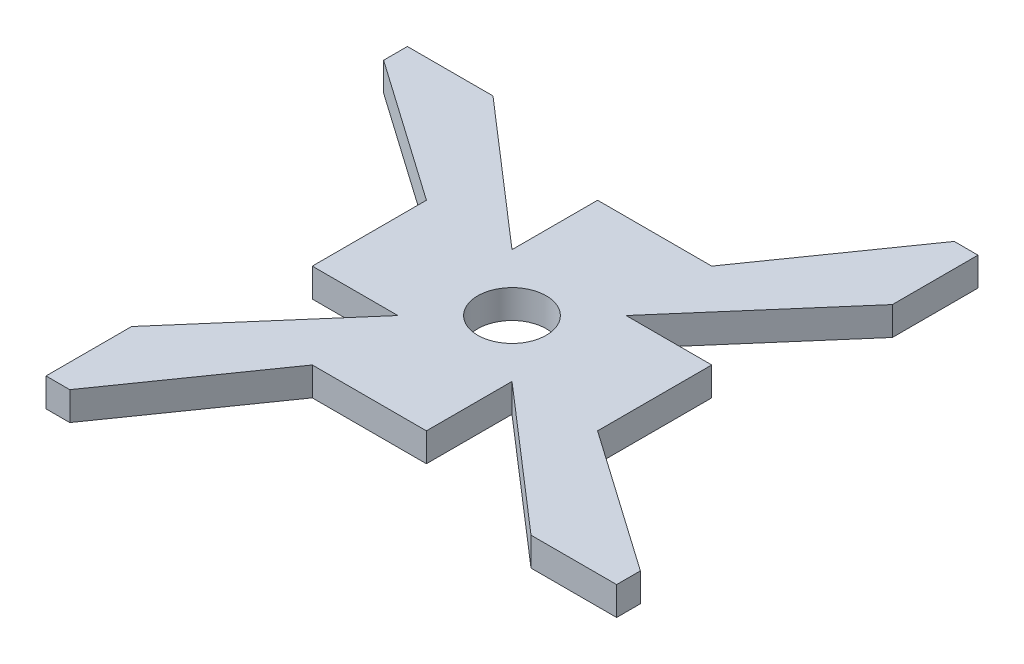
ISO-10303-21;
HEADER;
FILE_DESCRIPTION(('STEP AP214'),'2;1');
FILE_NAME('part.step','',(''),(''),'','','');
FILE_SCHEMA(('AUTOMOTIVE_DESIGN { 1 0 10303 214 1 1 1 1 }'));
ENDSEC;
DATA;
#1=APPLICATION_CONTEXT('core data for automotive mechanical design processes');
#2=APPLICATION_PROTOCOL_DEFINITION('international standard','automotive_design',2000,#1);
#3=PRODUCT_CONTEXT('',#1,'mechanical');
#4=PRODUCT('Part','Part','',(#3));
#5=PRODUCT_RELATED_PRODUCT_CATEGORY('part','',(#4));
#6=PRODUCT_DEFINITION_FORMATION('','',#4);
#7=PRODUCT_DEFINITION_CONTEXT('part definition',#1,'design');
#8=PRODUCT_DEFINITION('design','',#6,#7);
#9=PRODUCT_DEFINITION_SHAPE('','',#8);
#10=(LENGTH_UNIT() NAMED_UNIT(*) SI_UNIT(.MILLI.,.METRE.));
#11=(NAMED_UNIT(*) PLANE_ANGLE_UNIT() SI_UNIT($,.RADIAN.));
#12=(NAMED_UNIT(*) SI_UNIT($,.STERADIAN.) SOLID_ANGLE_UNIT());
#13=UNCERTAINTY_MEASURE_WITH_UNIT(LENGTH_MEASURE(1.E-05),#10,'distance_accuracy_value','');
#14=(GEOMETRIC_REPRESENTATION_CONTEXT(3) GLOBAL_UNCERTAINTY_ASSIGNED_CONTEXT((#13)) GLOBAL_UNIT_ASSIGNED_CONTEXT((#10,
#11,#12)) REPRESENTATION_CONTEXT('',''));
#15=CARTESIAN_POINT('',(0.,0.,0.));
#16=DIRECTION('',(0.,0.,1.));
#17=DIRECTION('',(1.,0.,0.));
#18=AXIS2_PLACEMENT_3D('',#15,#16,#17);
#19=CARTESIAN_POINT('',(-6.00000000000001,3.,0.));
#20=DIRECTION('',(1.,0.,0.));
#21=DIRECTION('',(0.,0.,-1.));
#22=AXIS2_PLACEMENT_3D('',#19,#20,#21);
#23=PLANE('',#22);
#24=DIRECTION('',(0.,0.,1.));
#25=VECTOR('',#24,1.);
#26=CARTESIAN_POINT('',(-6.00000000000001,0.,0.));
#27=LINE('',#26,#25);
#28=CARTESIAN_POINT('',(-6.00000000000001,0.,-15.));
#29=VERTEX_POINT('',#28);
#30=CARTESIAN_POINT('',(-6.00000000000001,0.,-6.));
#31=VERTEX_POINT('',#30);
#32=EDGE_CURVE('E240',#29,#31,#27,.T.);
#33=ORIENTED_EDGE('',*,*,#32,.T.);
#34=DIRECTION('',(0.,-1.,0.));
#35=VECTOR('',#34,1.);
#36=CARTESIAN_POINT('',(-6.00000000000001,3.,-6.));
#37=LINE('',#36,#35);
#38=CARTESIAN_POINT('',(-6.00000000000001,3.,-6.));
#39=VERTEX_POINT('',#38);
#40=EDGE_CURVE('E11',#39,#31,#37,.T.);
#41=ORIENTED_EDGE('',*,*,#40,.F.);
#42=DIRECTION('',(0.,0.,1.));
#43=VECTOR('',#42,1.);
#44=CARTESIAN_POINT('',(-6.00000000000001,3.,0.));
#45=LINE('',#44,#43);
#46=CARTESIAN_POINT('',(-6.00000000000001,3.,-15.));
#47=VERTEX_POINT('',#46);
#48=EDGE_CURVE('E142',#47,#39,#45,.T.);
#49=ORIENTED_EDGE('',*,*,#48,.F.);
#50=DIRECTION('',(0.,-1.,0.));
#51=VECTOR('',#50,1.);
#52=CARTESIAN_POINT('',(-6.00000000000001,3.,-15.));
#53=LINE('',#52,#51);
#54=EDGE_CURVE('E56',#47,#29,#53,.T.);
#55=ORIENTED_EDGE('',*,*,#54,.T.);
#56=EDGE_LOOP('',(#33,#41,#49,#55));
#57=FACE_BOUND('',#56,.T.);
#58=ADVANCED_FACE('F39',(#57),#23,.F.);
#59=CARTESIAN_POINT('',(0.395939086294416,3.,-0.456852791878173));
#60=DIRECTION('',(0.654930538417841,0.,-0.755689082789818));
#61=DIRECTION('',(-0.755689082789818,0.,-0.654930538417842));
#62=AXIS2_PLACEMENT_3D('',#59,#60,#61);
#63=PLANE('',#62);
#64=DIRECTION('',(0.755689082789818,0.,0.654930538417841));
#65=VECTOR('',#64,1.);
#66=CARTESIAN_POINT('',(0.395939086294416,0.,-0.456852791878173));
#67=LINE('',#66,#65);
#68=CARTESIAN_POINT('',(-21.,0.,-19.));
#69=VERTEX_POINT('',#68);
#70=EDGE_CURVE('E243',#69,#31,#67,.T.);
#71=ORIENTED_EDGE('',*,*,#70,.F.);
#72=DIRECTION('',(0.,-1.,0.));
#73=VECTOR('',#72,1.);
#74=CARTESIAN_POINT('',(-21.,3.,-19.));
#75=LINE('',#74,#73);
#76=CARTESIAN_POINT('',(-21.,3.,-19.));
#77=VERTEX_POINT('',#76);
#78=EDGE_CURVE('E48',#77,#69,#75,.T.);
#79=ORIENTED_EDGE('',*,*,#78,.F.);
#80=DIRECTION('',(0.755689082789818,0.,0.654930538417841));
#81=VECTOR('',#80,1.);
#82=CARTESIAN_POINT('',(0.395939086294416,3.,-0.456852791878173));
#83=LINE('',#82,#81);
#84=EDGE_CURVE('E501',#77,#39,#83,.T.);
#85=ORIENTED_EDGE('',*,*,#84,.T.);
#86=ORIENTED_EDGE('',*,*,#40,.T.);
#87=EDGE_LOOP('',(#71,#79,#85,#86));
#88=FACE_BOUND('',#87,.T.);
#89=ADVANCED_FACE('F405',(#88),#63,.T.);
#90=CARTESIAN_POINT('',(0.,3.,-19.));
#91=DIRECTION('',(0.,0.,-1.));
#92=DIRECTION('',(-1.,0.,0.));
#93=AXIS2_PLACEMENT_3D('',#90,#91,#92);
#94=PLANE('',#93);
#95=DIRECTION('',(1.,0.,0.));
#96=VECTOR('',#95,1.);
#97=CARTESIAN_POINT('',(0.,0.,-19.));
#98=LINE('',#97,#96);
#99=CARTESIAN_POINT('',(-30.,0.,-19.));
#100=VERTEX_POINT('',#99);
#101=EDGE_CURVE('E247',#100,#69,#98,.T.);
#102=ORIENTED_EDGE('',*,*,#101,.F.);
#103=DIRECTION('',(0.,-1.,0.));
#104=VECTOR('',#103,1.);
#105=CARTESIAN_POINT('',(-30.,3.,-19.));
#106=LINE('',#105,#104);
#107=CARTESIAN_POINT('',(-30.,3.,-19.));
#108=VERTEX_POINT('',#107);
#109=EDGE_CURVE('E393',#108,#100,#106,.T.);
#110=ORIENTED_EDGE('',*,*,#109,.F.);
#111=DIRECTION('',(1.,0.,0.));
#112=VECTOR('',#111,1.);
#113=CARTESIAN_POINT('',(0.,3.,-19.));
#114=LINE('',#113,#112);
#115=EDGE_CURVE('E402',#108,#77,#114,.T.);
#116=ORIENTED_EDGE('',*,*,#115,.T.);
#117=ORIENTED_EDGE('',*,*,#78,.T.);
#118=EDGE_LOOP('',(#102,#110,#116,#117));
#119=FACE_BOUND('',#118,.T.);
#120=ADVANCED_FACE('F400',(#119),#94,.T.);
#121=CARTESIAN_POINT('',(-30.,3.,0.));
#122=DIRECTION('',(1.,0.,0.));
#123=DIRECTION('',(0.,0.,-1.));
#124=AXIS2_PLACEMENT_3D('',#121,#122,#123);
#125=PLANE('',#124);
#126=DIRECTION('',(0.,0.,1.));
#127=VECTOR('',#126,1.);
#128=CARTESIAN_POINT('',(-30.,0.,0.));
#129=LINE('',#128,#127);
#130=CARTESIAN_POINT('',(-30.,0.,-16.5));
#131=VERTEX_POINT('',#130);
#132=EDGE_CURVE('E251',#100,#131,#129,.T.);
#133=ORIENTED_EDGE('',*,*,#132,.T.);
#134=DIRECTION('',(0.,-1.,0.));
#135=VECTOR('',#134,1.);
#136=CARTESIAN_POINT('',(-30.,3.,-16.5));
#137=LINE('',#136,#135);
#138=CARTESIAN_POINT('',(-30.,3.,-16.5));
#139=VERTEX_POINT('',#138);
#140=EDGE_CURVE('E389',#139,#131,#137,.T.);
#141=ORIENTED_EDGE('',*,*,#140,.F.);
#142=DIRECTION('',(0.,0.,1.));
#143=VECTOR('',#142,1.);
#144=CARTESIAN_POINT('',(-30.,3.,0.));
#145=LINE('',#144,#143);
#146=EDGE_CURVE('E424',#108,#139,#145,.T.);
#147=ORIENTED_EDGE('',*,*,#146,.F.);
#148=ORIENTED_EDGE('',*,*,#109,.T.);
#149=EDGE_LOOP('',(#133,#141,#147,#148));
#150=FACE_BOUND('',#149,.T.);
#151=ADVANCED_FACE('F414',(#150),#125,.F.);
#152=CARTESIAN_POINT('',(-2.11409395973153,3.,3.02013422818791));
#153=DIRECTION('',(0.573462344363328,0.,-0.819231920519041));
#154=DIRECTION('',(-0.819231920519041,0.,-0.573462344363328));
#155=AXIS2_PLACEMENT_3D('',#152,#153,#154);
#156=PLANE('',#155);
#157=DIRECTION('',(0.819231920519041,0.,0.573462344363328));
#158=VECTOR('',#157,1.);
#159=CARTESIAN_POINT('',(-2.11409395973153,0.,3.02013422818791));
#160=LINE('',#159,#158);
#161=CARTESIAN_POINT('',(-15.,0.,-6.00000000000001));
#162=VERTEX_POINT('',#161);
#163=EDGE_CURVE('E254',#131,#162,#160,.T.);
#164=ORIENTED_EDGE('',*,*,#163,.T.);
#165=DIRECTION('',(0.,-1.,0.));
#166=VECTOR('',#165,1.);
#167=CARTESIAN_POINT('',(-15.,3.,-6.00000000000001));
#168=LINE('',#167,#166);
#169=CARTESIAN_POINT('',(-15.,3.,-6.00000000000001));
#170=VERTEX_POINT('',#169);
#171=EDGE_CURVE('E385',#170,#162,#168,.T.);
#172=ORIENTED_EDGE('',*,*,#171,.F.);
#173=DIRECTION('',(0.819231920519041,0.,0.573462344363328));
#174=VECTOR('',#173,1.);
#175=CARTESIAN_POINT('',(-2.11409395973153,3.,3.02013422818791));
#176=LINE('',#175,#174);
#177=EDGE_CURVE('E420',#139,#170,#176,.T.);
#178=ORIENTED_EDGE('',*,*,#177,.F.);
#179=ORIENTED_EDGE('',*,*,#140,.T.);
#180=EDGE_LOOP('',(#164,#172,#178,#179));
#181=FACE_BOUND('',#180,.T.);
#182=ADVANCED_FACE('F418',(#181),#156,.F.);
#183=CARTESIAN_POINT('',(-15.,3.,0.));
#184=DIRECTION('',(1.,0.,0.));
#185=DIRECTION('',(0.,0.,-1.));
#186=AXIS2_PLACEMENT_3D('',#183,#184,#185);
#187=PLANE('',#186);
#188=DIRECTION('',(0.,0.,1.));
#189=VECTOR('',#188,1.);
#190=CARTESIAN_POINT('',(-15.,0.,0.));
#191=LINE('',#190,#189);
#192=CARTESIAN_POINT('',(-15.,0.,6.00000000000001));
#193=VERTEX_POINT('',#192);
#194=EDGE_CURVE('E257',#162,#193,#191,.T.);
#195=ORIENTED_EDGE('',*,*,#194,.T.);
#196=DIRECTION('',(0.,-1.,0.));
#197=VECTOR('',#196,1.);
#198=CARTESIAN_POINT('',(-15.,3.,6.00000000000001));
#199=LINE('',#198,#197);
#200=CARTESIAN_POINT('',(-15.,3.,6.00000000000001));
#201=VERTEX_POINT('',#200);
#202=EDGE_CURVE('E381',#201,#193,#199,.T.);
#203=ORIENTED_EDGE('',*,*,#202,.F.);
#204=DIRECTION('',(0.,0.,1.));
#205=VECTOR('',#204,1.);
#206=CARTESIAN_POINT('',(-15.,3.,0.));
#207=LINE('',#206,#205);
#208=EDGE_CURVE('E423',#170,#201,#207,.T.);
#209=ORIENTED_EDGE('',*,*,#208,.F.);
#210=ORIENTED_EDGE('',*,*,#171,.T.);
#211=EDGE_LOOP('',(#195,#203,#209,#210));
#212=FACE_BOUND('',#211,.T.);
#213=ADVANCED_FACE('F516',(#212),#187,.F.);
#214=CARTESIAN_POINT('',(0.,3.,6.00000000000001));
#215=DIRECTION('',(0.,0.,-1.));
#216=DIRECTION('',(-1.,0.,0.));
#217=AXIS2_PLACEMENT_3D('',#214,#215,#216);
#218=PLANE('',#217);
#219=DIRECTION('',(1.,0.,0.));
#220=VECTOR('',#219,1.);
#221=CARTESIAN_POINT('',(0.,0.,6.00000000000001));
#222=LINE('',#221,#220);
#223=CARTESIAN_POINT('',(-6.00000000000001,0.,6.00000000000001));
#224=VERTEX_POINT('',#223);
#225=EDGE_CURVE('E260',#193,#224,#222,.T.);
#226=ORIENTED_EDGE('',*,*,#225,.T.);
#227=DIRECTION('',(0.,-1.,0.));
#228=VECTOR('',#227,1.);
#229=CARTESIAN_POINT('',(-6.00000000000001,3.,6.00000000000001));
#230=LINE('',#229,#228);
#231=CARTESIAN_POINT('',(-6.00000000000001,3.,6.00000000000001));
#232=VERTEX_POINT('',#231);
#233=EDGE_CURVE('E378',#232,#224,#230,.T.);
#234=ORIENTED_EDGE('',*,*,#233,.F.);
#235=DIRECTION('',(1.,0.,0.));
#236=VECTOR('',#235,1.);
#237=CARTESIAN_POINT('',(0.,3.,6.00000000000001));
#238=LINE('',#237,#236);
#239=EDGE_CURVE('E428',#201,#232,#238,.T.);
#240=ORIENTED_EDGE('',*,*,#239,.F.);
#241=ORIENTED_EDGE('',*,*,#202,.T.);
#242=EDGE_LOOP('',(#226,#234,#240,#241));
#243=FACE_BOUND('',#242,.T.);
#244=ADVANCED_FACE('F519',(#243),#218,.F.);
#245=CARTESIAN_POINT('',(-0.456852791873291,3.,-0.395939086290185));
#246=DIRECTION('',(-0.755689082789818,0.,-0.654930538417841));
#247=DIRECTION('',(-0.654930538417841,0.,0.755689082789818));
#248=AXIS2_PLACEMENT_3D('',#245,#246,#247);
#249=PLANE('',#248);
#250=DIRECTION('',(0.654930538417841,0.,-0.755689082789818));
#251=VECTOR('',#250,1.);
#252=CARTESIAN_POINT('',(-0.456852791873291,0.,-0.395939086290185));
#253=LINE('',#252,#251);
#254=CARTESIAN_POINT('',(-18.9999999999914,0.,21.));
#255=VERTEX_POINT('',#254);
#256=EDGE_CURVE('E264',#255,#224,#253,.T.);
#257=ORIENTED_EDGE('',*,*,#256,.F.);
#258=DIRECTION('',(0.,-1.,0.));
#259=VECTOR('',#258,1.);
#260=CARTESIAN_POINT('',(-18.9999999999914,3.,21.));
#261=LINE('',#260,#259);
#262=CARTESIAN_POINT('',(-18.9999999999914,3.,21.));
#263=VERTEX_POINT('',#262);
#264=EDGE_CURVE('E375',#263,#255,#261,.T.);
#265=ORIENTED_EDGE('',*,*,#264,.F.);
#266=DIRECTION('',(0.654930538417841,0.,-0.755689082789818));
#267=VECTOR('',#266,1.);
#268=CARTESIAN_POINT('',(-0.456852791873291,3.,-0.395939086290185));
#269=LINE('',#268,#267);
#270=EDGE_CURVE('E435',#263,#232,#269,.T.);
#271=ORIENTED_EDGE('',*,*,#270,.T.);
#272=ORIENTED_EDGE('',*,*,#233,.T.);
#273=EDGE_LOOP('',(#257,#265,#271,#272));
#274=FACE_BOUND('',#273,.T.);
#275=ADVANCED_FACE('F523',(#274),#249,.T.);
#276=CARTESIAN_POINT('',(-18.9999999999914,3.,0.));
#277=DIRECTION('',(-1.,0.,0.));
#278=DIRECTION('',(0.,0.,1.));
#279=AXIS2_PLACEMENT_3D('',#276,#277,#278);
#280=PLANE('',#279);
#281=DIRECTION('',(0.,0.,-1.));
#282=VECTOR('',#281,1.);
#283=CARTESIAN_POINT('',(-18.9999999999914,0.,0.));
#284=LINE('',#283,#282);
#285=CARTESIAN_POINT('',(-18.9999999999914,0.,30.));
#286=VERTEX_POINT('',#285);
#287=EDGE_CURVE('E268',#286,#255,#284,.T.);
#288=ORIENTED_EDGE('',*,*,#287,.F.);
#289=DIRECTION('',(0.,-1.,0.));
#290=VECTOR('',#289,1.);
#291=CARTESIAN_POINT('',(-18.9999999999914,3.,30.));
#292=LINE('',#291,#290);
#293=CARTESIAN_POINT('',(-18.9999999999914,3.,30.));
#294=VERTEX_POINT('',#293);
#295=EDGE_CURVE('E372',#294,#286,#292,.T.);
#296=ORIENTED_EDGE('',*,*,#295,.F.);
#297=DIRECTION('',(0.,0.,-1.));
#298=VECTOR('',#297,1.);
#299=CARTESIAN_POINT('',(-18.9999999999914,3.,0.));
#300=LINE('',#299,#298);
#301=EDGE_CURVE('E439',#294,#263,#300,.T.);
#302=ORIENTED_EDGE('',*,*,#301,.T.);
#303=ORIENTED_EDGE('',*,*,#264,.T.);
#304=EDGE_LOOP('',(#288,#296,#302,#303));
#305=FACE_BOUND('',#304,.T.);
#306=ADVANCED_FACE('F527',(#305),#280,.T.);
#307=CARTESIAN_POINT('',(0.,3.,30.));
#308=DIRECTION('',(0.,0.,-1.));
#309=DIRECTION('',(-1.,0.,0.));
#310=AXIS2_PLACEMENT_3D('',#307,#308,#309);
#311=PLANE('',#310);
#312=DIRECTION('',(1.,0.,0.));
#313=VECTOR('',#312,1.);
#314=CARTESIAN_POINT('',(0.,0.,30.));
#315=LINE('',#314,#313);
#316=CARTESIAN_POINT('',(-16.4999999999914,0.,30.));
#317=VERTEX_POINT('',#316);
#318=EDGE_CURVE('E272',#286,#317,#315,.T.);
#319=ORIENTED_EDGE('',*,*,#318,.T.);
#320=DIRECTION('',(0.,-1.,0.));
#321=VECTOR('',#320,1.);
#322=CARTESIAN_POINT('',(-16.4999999999914,3.,30.));
#323=LINE('',#322,#321);
#324=CARTESIAN_POINT('',(-16.4999999999914,3.,30.));
#325=VERTEX_POINT('',#324);
#326=EDGE_CURVE('E368',#325,#317,#323,.T.);
#327=ORIENTED_EDGE('',*,*,#326,.F.);
#328=DIRECTION('',(1.,0.,0.));
#329=VECTOR('',#328,1.);
#330=CARTESIAN_POINT('',(0.,3.,30.));
#331=LINE('',#330,#329);
#332=EDGE_CURVE('E443',#294,#325,#331,.T.);
#333=ORIENTED_EDGE('',*,*,#332,.F.);
#334=ORIENTED_EDGE('',*,*,#295,.T.);
#335=EDGE_LOOP('',(#319,#327,#333,#334));
#336=FACE_BOUND('',#335,.T.);
#337=ADVANCED_FACE('F531',(#336),#311,.F.);
#338=CARTESIAN_POINT('',(3.02013422819364,3.,2.11409395973554));
#339=DIRECTION('',(-0.819231920519041,0.,-0.573462344363327));
#340=DIRECTION('',(-0.573462344363327,0.,0.819231920519041));
#341=AXIS2_PLACEMENT_3D('',#338,#339,#340);
#342=PLANE('',#341);
#343=DIRECTION('',(0.573462344363327,0.,-0.819231920519041));
#344=VECTOR('',#343,1.);
#345=CARTESIAN_POINT('',(3.02013422819364,0.,2.11409395973554));
#346=LINE('',#345,#344);
#347=CARTESIAN_POINT('',(-6.00000000000001,0.,15.));
#348=VERTEX_POINT('',#347);
#349=EDGE_CURVE('E275',#317,#348,#346,.T.);
#350=ORIENTED_EDGE('',*,*,#349,.T.);
#351=DIRECTION('',(0.,-1.,0.));
#352=VECTOR('',#351,1.);
#353=CARTESIAN_POINT('',(-6.00000000000001,3.,15.));
#354=LINE('',#353,#352);
#355=CARTESIAN_POINT('',(-6.00000000000001,3.,15.));
#356=VERTEX_POINT('',#355);
#357=EDGE_CURVE('E364',#356,#348,#354,.T.);
#358=ORIENTED_EDGE('',*,*,#357,.F.);
#359=DIRECTION('',(0.573462344363327,0.,-0.819231920519041));
#360=VECTOR('',#359,1.);
#361=CARTESIAN_POINT('',(3.02013422819364,3.,2.11409395973554));
#362=LINE('',#361,#360);
#363=EDGE_CURVE('E446',#325,#356,#362,.T.);
#364=ORIENTED_EDGE('',*,*,#363,.F.);
#365=ORIENTED_EDGE('',*,*,#326,.T.);
#366=EDGE_LOOP('',(#350,#358,#364,#365));
#367=FACE_BOUND('',#366,.T.);
#368=ADVANCED_FACE('F535',(#367),#342,.F.);
#369=CARTESIAN_POINT('',(0.,3.,15.));
#370=DIRECTION('',(0.,0.,-1.));
#371=DIRECTION('',(-1.,0.,0.));
#372=AXIS2_PLACEMENT_3D('',#369,#370,#371);
#373=PLANE('',#372);
#374=DIRECTION('',(1.,0.,0.));
#375=VECTOR('',#374,1.);
#376=CARTESIAN_POINT('',(0.,0.,15.));
#377=LINE('',#376,#375);
#378=CARTESIAN_POINT('',(6.00000000000001,0.,15.));
#379=VERTEX_POINT('',#378);
#380=EDGE_CURVE('E278',#348,#379,#377,.T.);
#381=ORIENTED_EDGE('',*,*,#380,.T.);
#382=DIRECTION('',(0.,-1.,0.));
#383=VECTOR('',#382,1.);
#384=CARTESIAN_POINT('',(6.00000000000001,3.,15.));
#385=LINE('',#384,#383);
#386=CARTESIAN_POINT('',(6.00000000000001,3.,15.));
#387=VERTEX_POINT('',#386);
#388=EDGE_CURVE('E361',#387,#379,#385,.T.);
#389=ORIENTED_EDGE('',*,*,#388,.F.);
#390=DIRECTION('',(1.,0.,0.));
#391=VECTOR('',#390,1.);
#392=CARTESIAN_POINT('',(0.,3.,15.));
#393=LINE('',#392,#391);
#394=EDGE_CURVE('E449',#356,#387,#393,.T.);
#395=ORIENTED_EDGE('',*,*,#394,.F.);
#396=ORIENTED_EDGE('',*,*,#357,.T.);
#397=EDGE_LOOP('',(#381,#389,#395,#396));
#398=FACE_BOUND('',#397,.T.);
#399=ADVANCED_FACE('F539',(#398),#373,.F.);
#400=CARTESIAN_POINT('',(6.00000000000001,3.,0.));
#401=DIRECTION('',(1.,0.,0.));
#402=DIRECTION('',(0.,0.,-1.));
#403=AXIS2_PLACEMENT_3D('',#400,#401,#402);
#404=PLANE('',#403);
#405=DIRECTION('',(0.,0.,1.));
#406=VECTOR('',#405,1.);
#407=CARTESIAN_POINT('',(6.00000000000001,0.,0.));
#408=LINE('',#407,#406);
#409=CARTESIAN_POINT('',(6.00000000000001,0.,6.00000000000001));
#410=VERTEX_POINT('',#409);
#411=EDGE_CURVE('E282',#410,#379,#408,.T.);
#412=ORIENTED_EDGE('',*,*,#411,.F.);
#413=DIRECTION('',(0.,-1.,0.));
#414=VECTOR('',#413,1.);
#415=CARTESIAN_POINT('',(6.00000000000001,3.,6.00000000000001));
#416=LINE('',#415,#414);
#417=CARTESIAN_POINT('',(6.00000000000001,3.,6.00000000000001));
#418=VERTEX_POINT('',#417);
#419=EDGE_CURVE('E358',#418,#410,#416,.T.);
#420=ORIENTED_EDGE('',*,*,#419,.F.);
#421=DIRECTION('',(0.,0.,1.));
#422=VECTOR('',#421,1.);
#423=CARTESIAN_POINT('',(6.00000000000001,3.,0.));
#424=LINE('',#423,#422);
#425=EDGE_CURVE('E452',#418,#387,#424,.T.);
#426=ORIENTED_EDGE('',*,*,#425,.T.);
#427=ORIENTED_EDGE('',*,*,#388,.T.);
#428=EDGE_LOOP('',(#412,#420,#426,#427));
#429=FACE_BOUND('',#428,.T.);
#430=ADVANCED_FACE('F543',(#429),#404,.T.);
#431=CARTESIAN_POINT('',(-0.395939086286519,3.,0.456852791869061));
#432=DIRECTION('',(-0.654930538417841,0.,0.755689082789818));
#433=DIRECTION('',(0.755689082789818,0.,0.654930538417841));
#434=AXIS2_PLACEMENT_3D('',#431,#432,#433);
#435=PLANE('',#434);
#436=DIRECTION('',(-0.755689082789818,0.,-0.654930538417841));
#437=VECTOR('',#436,1.);
#438=CARTESIAN_POINT('',(-0.395939086286519,0.,0.456852791869061));
#439=LINE('',#438,#437);
#440=CARTESIAN_POINT('',(21.0000000000086,0.,18.9999999999914));
#441=VERTEX_POINT('',#440);
#442=EDGE_CURVE('E286',#441,#410,#439,.T.);
#443=ORIENTED_EDGE('',*,*,#442,.F.);
#444=DIRECTION('',(0.,-1.,0.));
#445=VECTOR('',#444,1.);
#446=CARTESIAN_POINT('',(21.0000000000086,3.,18.9999999999914));
#447=LINE('',#446,#445);
#448=CARTESIAN_POINT('',(21.0000000000086,3.,18.9999999999914));
#449=VERTEX_POINT('',#448);
#450=EDGE_CURVE('E355',#449,#441,#447,.T.);
#451=ORIENTED_EDGE('',*,*,#450,.F.);
#452=DIRECTION('',(-0.755689082789818,0.,-0.654930538417841));
#453=VECTOR('',#452,1.);
#454=CARTESIAN_POINT('',(-0.395939086286519,3.,0.456852791869061));
#455=LINE('',#454,#453);
#456=EDGE_CURVE('E456',#449,#418,#455,.T.);
#457=ORIENTED_EDGE('',*,*,#456,.T.);
#458=ORIENTED_EDGE('',*,*,#419,.T.);
#459=EDGE_LOOP('',(#443,#451,#457,#458));
#460=FACE_BOUND('',#459,.T.);
#461=ADVANCED_FACE('F547',(#460),#435,.T.);
#462=CARTESIAN_POINT('',(0.,3.,18.9999999999914));
#463=DIRECTION('',(0.,0.,1.));
#464=DIRECTION('',(1.,0.,0.));
#465=AXIS2_PLACEMENT_3D('',#462,#463,#464);
#466=PLANE('',#465);
#467=DIRECTION('',(-1.,0.,0.));
#468=VECTOR('',#467,1.);
#469=CARTESIAN_POINT('',(0.,0.,18.9999999999914));
#470=LINE('',#469,#468);
#471=CARTESIAN_POINT('',(30.0000000000086,0.,18.9999999999914));
#472=VERTEX_POINT('',#471);
#473=EDGE_CURVE('E290',#472,#441,#470,.T.);
#474=ORIENTED_EDGE('',*,*,#473,.F.);
#475=DIRECTION('',(0.,-1.,0.));
#476=VECTOR('',#475,1.);
#477=CARTESIAN_POINT('',(30.0000000000086,3.,18.9999999999914));
#478=LINE('',#477,#476);
#479=CARTESIAN_POINT('',(30.0000000000086,3.,18.9999999999914));
#480=VERTEX_POINT('',#479);
#481=EDGE_CURVE('E352',#480,#472,#478,.T.);
#482=ORIENTED_EDGE('',*,*,#481,.F.);
#483=DIRECTION('',(-1.,0.,0.));
#484=VECTOR('',#483,1.);
#485=CARTESIAN_POINT('',(0.,3.,18.9999999999914));
#486=LINE('',#485,#484);
#487=EDGE_CURVE('E460',#480,#449,#486,.T.);
#488=ORIENTED_EDGE('',*,*,#487,.T.);
#489=ORIENTED_EDGE('',*,*,#450,.T.);
#490=EDGE_LOOP('',(#474,#482,#488,#489));
#491=FACE_BOUND('',#490,.T.);
#492=ADVANCED_FACE('F551',(#491),#466,.T.);
#493=CARTESIAN_POINT('',(30.0000000000086,3.,0.));
#494=DIRECTION('',(-1.,0.,0.));
#495=DIRECTION('',(0.,0.,1.));
#496=AXIS2_PLACEMENT_3D('',#493,#494,#495);
#497=PLANE('',#496);
#498=DIRECTION('',(0.,0.,-1.));
#499=VECTOR('',#498,1.);
#500=CARTESIAN_POINT('',(30.0000000000086,0.,0.));
#501=LINE('',#500,#499);
#502=CARTESIAN_POINT('',(30.0000000000086,0.,16.4999999999914));
#503=VERTEX_POINT('',#502);
#504=EDGE_CURVE('E294',#472,#503,#501,.T.);
#505=ORIENTED_EDGE('',*,*,#504,.T.);
#506=DIRECTION('',(0.,-1.,0.));
#507=VECTOR('',#506,1.);
#508=CARTESIAN_POINT('',(30.0000000000086,3.,16.4999999999914));
#509=LINE('',#508,#507);
#510=CARTESIAN_POINT('',(30.0000000000086,3.,16.4999999999914));
#511=VERTEX_POINT('',#510);
#512=EDGE_CURVE('E348',#511,#503,#509,.T.);
#513=ORIENTED_EDGE('',*,*,#512,.F.);
#514=DIRECTION('',(0.,0.,-1.));
#515=VECTOR('',#514,1.);
#516=CARTESIAN_POINT('',(30.0000000000086,3.,0.));
#517=LINE('',#516,#515);
#518=EDGE_CURVE('E464',#480,#511,#517,.T.);
#519=ORIENTED_EDGE('',*,*,#518,.F.);
#520=ORIENTED_EDGE('',*,*,#481,.T.);
#521=EDGE_LOOP('',(#505,#513,#519,#520));
#522=FACE_BOUND('',#521,.T.);
#523=ADVANCED_FACE('F555',(#522),#497,.F.);
#524=CARTESIAN_POINT('',(2.11409395973836,3.,-3.02013422819766));
#525=DIRECTION('',(-0.573462344363327,0.,0.819231920519041));
#526=DIRECTION('',(0.819231920519041,0.,0.573462344363328));
#527=AXIS2_PLACEMENT_3D('',#524,#525,#526);
#528=PLANE('',#527);
#529=DIRECTION('',(-0.819231920519041,0.,-0.573462344363328));
#530=VECTOR('',#529,1.);
#531=CARTESIAN_POINT('',(2.11409395973836,0.,-3.02013422819766));
#532=LINE('',#531,#530);
#533=CARTESIAN_POINT('',(15.,0.,6.00000000000001));
#534=VERTEX_POINT('',#533);
#535=EDGE_CURVE('E297',#503,#534,#532,.T.);
#536=ORIENTED_EDGE('',*,*,#535,.T.);
#537=DIRECTION('',(0.,-1.,0.));
#538=VECTOR('',#537,1.);
#539=CARTESIAN_POINT('',(15.,3.,6.00000000000001));
#540=LINE('',#539,#538);
#541=CARTESIAN_POINT('',(15.,3.,6.00000000000001));
#542=VERTEX_POINT('',#541);
#543=EDGE_CURVE('E345',#542,#534,#540,.T.);
#544=ORIENTED_EDGE('',*,*,#543,.F.);
#545=DIRECTION('',(-0.819231920519041,0.,-0.573462344363328));
#546=VECTOR('',#545,1.);
#547=CARTESIAN_POINT('',(2.11409395973836,3.,-3.02013422819766));
#548=LINE('',#547,#546);
#549=EDGE_CURVE('E467',#511,#542,#548,.T.);
#550=ORIENTED_EDGE('',*,*,#549,.F.);
#551=ORIENTED_EDGE('',*,*,#512,.T.);
#552=EDGE_LOOP('',(#536,#544,#550,#551));
#553=FACE_BOUND('',#552,.T.);
#554=ADVANCED_FACE('F559',(#553),#528,.F.);
#555=CARTESIAN_POINT('',(15.,3.,0.));
#556=DIRECTION('',(1.,0.,0.));
#557=DIRECTION('',(0.,0.,-1.));
#558=AXIS2_PLACEMENT_3D('',#555,#556,#557);
#559=PLANE('',#558);
#560=DIRECTION('',(0.,0.,1.));
#561=VECTOR('',#560,1.);
#562=CARTESIAN_POINT('',(15.,0.,0.));
#563=LINE('',#562,#561);
#564=CARTESIAN_POINT('',(15.,0.,-6.));
#565=VERTEX_POINT('',#564);
#566=EDGE_CURVE('E301',#565,#534,#563,.T.);
#567=ORIENTED_EDGE('',*,*,#566,.F.);
#568=DIRECTION('',(0.,-1.,0.));
#569=VECTOR('',#568,1.);
#570=CARTESIAN_POINT('',(15.,3.,-6.));
#571=LINE('',#570,#569);
#572=CARTESIAN_POINT('',(15.,3.,-6.));
#573=VERTEX_POINT('',#572);
#574=EDGE_CURVE('E342',#573,#565,#571,.T.);
#575=ORIENTED_EDGE('',*,*,#574,.F.);
#576=DIRECTION('',(0.,0.,1.));
#577=VECTOR('',#576,1.);
#578=CARTESIAN_POINT('',(15.,3.,0.));
#579=LINE('',#578,#577);
#580=EDGE_CURVE('E470',#573,#542,#579,.T.);
#581=ORIENTED_EDGE('',*,*,#580,.T.);
#582=ORIENTED_EDGE('',*,*,#543,.T.);
#583=EDGE_LOOP('',(#567,#575,#581,#582));
#584=FACE_BOUND('',#583,.T.);
#585=ADVANCED_FACE('F563',(#584),#559,.T.);
#586=CARTESIAN_POINT('',(0.,3.,-6.));
#587=DIRECTION('',(0.,0.,-1.));
#588=DIRECTION('',(-1.,0.,0.));
#589=AXIS2_PLACEMENT_3D('',#586,#587,#588);
#590=PLANE('',#589);
#591=DIRECTION('',(1.,0.,0.));
#592=VECTOR('',#591,1.);
#593=CARTESIAN_POINT('',(0.,0.,-6.));
#594=LINE('',#593,#592);
#595=CARTESIAN_POINT('',(6.00000000000001,0.,-6.));
#596=VERTEX_POINT('',#595);
#597=EDGE_CURVE('E305',#596,#565,#594,.T.);
#598=ORIENTED_EDGE('',*,*,#597,.F.);
#599=DIRECTION('',(0.,-1.,0.));
#600=VECTOR('',#599,1.);
#601=CARTESIAN_POINT('',(6.00000000000001,3.,-6.));
#602=LINE('',#601,#600);
#603=CARTESIAN_POINT('',(6.00000000000001,3.,-6.));
#604=VERTEX_POINT('',#603);
#605=EDGE_CURVE('E339',#604,#596,#602,.T.);
#606=ORIENTED_EDGE('',*,*,#605,.F.);
#607=DIRECTION('',(1.,0.,0.));
#608=VECTOR('',#607,1.);
#609=CARTESIAN_POINT('',(0.,3.,-6.));
#610=LINE('',#609,#608);
#611=EDGE_CURVE('E474',#604,#573,#610,.T.);
#612=ORIENTED_EDGE('',*,*,#611,.T.);
#613=ORIENTED_EDGE('',*,*,#574,.T.);
#614=EDGE_LOOP('',(#598,#606,#612,#613));
#615=FACE_BOUND('',#614,.T.);
#616=ADVANCED_FACE('F567',(#615),#590,.T.);
#617=CARTESIAN_POINT('',(0.456852791873941,3.,0.395939086290749));
#618=DIRECTION('',(0.755689082789818,0.,0.654930538417841));
#619=DIRECTION('',(0.654930538417842,0.,-0.755689082789818));
#620=AXIS2_PLACEMENT_3D('',#617,#618,#619);
#621=PLANE('',#620);
#622=DIRECTION('',(-0.654930538417842,0.,0.755689082789818));
#623=VECTOR('',#622,1.);
#624=CARTESIAN_POINT('',(0.456852791873941,0.,0.395939086290749));
#625=LINE('',#624,#623);
#626=CARTESIAN_POINT('',(19.,0.,-21.0000000000086));
#627=VERTEX_POINT('',#626);
#628=EDGE_CURVE('E309',#627,#596,#625,.T.);
#629=ORIENTED_EDGE('',*,*,#628,.F.);
#630=DIRECTION('',(0.,-1.,0.));
#631=VECTOR('',#630,1.);
#632=CARTESIAN_POINT('',(19.,3.,-21.0000000000086));
#633=LINE('',#632,#631);
#634=CARTESIAN_POINT('',(19.,3.,-21.0000000000086));
#635=VERTEX_POINT('',#634);
#636=EDGE_CURVE('E336',#635,#627,#633,.T.);
#637=ORIENTED_EDGE('',*,*,#636,.F.);
#638=DIRECTION('',(-0.654930538417842,0.,0.755689082789818));
#639=VECTOR('',#638,1.);
#640=CARTESIAN_POINT('',(0.456852791873941,3.,0.395939086290749));
#641=LINE('',#640,#639);
#642=EDGE_CURVE('E478',#635,#604,#641,.T.);
#643=ORIENTED_EDGE('',*,*,#642,.T.);
#644=ORIENTED_EDGE('',*,*,#605,.T.);
#645=EDGE_LOOP('',(#629,#637,#643,#644));
#646=FACE_BOUND('',#645,.T.);
#647=ADVANCED_FACE('F571',(#646),#621,.T.);
#648=CARTESIAN_POINT('',(19.,3.,0.));
#649=DIRECTION('',(1.,0.,0.));
#650=DIRECTION('',(0.,0.,-1.));
#651=AXIS2_PLACEMENT_3D('',#648,#649,#650);
#652=PLANE('',#651);
#653=DIRECTION('',(0.,0.,1.));
#654=VECTOR('',#653,1.);
#655=CARTESIAN_POINT('',(19.,0.,0.));
#656=LINE('',#655,#654);
#657=CARTESIAN_POINT('',(19.,0.,-30.0000000000086));
#658=VERTEX_POINT('',#657);
#659=EDGE_CURVE('E313',#658,#627,#656,.T.);
#660=ORIENTED_EDGE('',*,*,#659,.F.);
#661=DIRECTION('',(0.,-1.,0.));
#662=VECTOR('',#661,1.);
#663=CARTESIAN_POINT('',(19.,3.,-30.0000000000086));
#664=LINE('',#663,#662);
#665=CARTESIAN_POINT('',(19.,3.,-30.0000000000086));
#666=VERTEX_POINT('',#665);
#667=EDGE_CURVE('E226',#666,#658,#664,.T.);
#668=ORIENTED_EDGE('',*,*,#667,.F.);
#669=DIRECTION('',(0.,0.,1.));
#670=VECTOR('',#669,1.);
#671=CARTESIAN_POINT('',(19.,3.,0.));
#672=LINE('',#671,#670);
#673=EDGE_CURVE('E214',#666,#635,#672,.T.);
#674=ORIENTED_EDGE('',*,*,#673,.T.);
#675=ORIENTED_EDGE('',*,*,#636,.T.);
#676=EDGE_LOOP('',(#660,#668,#674,#675));
#677=FACE_BOUND('',#676,.T.);
#678=ADVANCED_FACE('F484',(#677),#652,.T.);
#679=CARTESIAN_POINT('',(0.,3.,-30.0000000000086));
#680=DIRECTION('',(0.,0.,1.));
#681=DIRECTION('',(1.,0.,0.));
#682=AXIS2_PLACEMENT_3D('',#679,#680,#681);
#683=PLANE('',#682);
#684=DIRECTION('',(-1.,0.,0.));
#685=VECTOR('',#684,1.);
#686=CARTESIAN_POINT('',(0.,0.,-30.0000000000086));
#687=LINE('',#686,#685);
#688=CARTESIAN_POINT('',(16.5,0.,-30.0000000000086));
#689=VERTEX_POINT('',#688);
#690=EDGE_CURVE('E222',#658,#689,#687,.T.);
#691=ORIENTED_EDGE('',*,*,#690,.T.);
#692=DIRECTION('',(0.,-1.,0.));
#693=VECTOR('',#692,1.);
#694=CARTESIAN_POINT('',(16.5,3.,-30.0000000000086));
#695=LINE('',#694,#693);
#696=CARTESIAN_POINT('',(16.5,3.,-30.0000000000086));
#697=VERTEX_POINT('',#696);
#698=EDGE_CURVE('E219',#697,#689,#695,.T.);
#699=ORIENTED_EDGE('',*,*,#698,.F.);
#700=DIRECTION('',(-1.,0.,0.));
#701=VECTOR('',#700,1.);
#702=CARTESIAN_POINT('',(0.,3.,-30.0000000000086));
#703=LINE('',#702,#701);
#704=EDGE_CURVE('E206',#666,#697,#703,.T.);
#705=ORIENTED_EDGE('',*,*,#704,.F.);
#706=ORIENTED_EDGE('',*,*,#667,.T.);
#707=EDGE_LOOP('',(#691,#699,#705,#706));
#708=FACE_BOUND('',#707,.T.);
#709=ADVANCED_FACE('F220',(#708),#683,.F.);
#710=CARTESIAN_POINT('',(-3.02013422819193,3.,-2.11409395973434));
#711=DIRECTION('',(0.819231920519041,0.,0.573462344363328));
#712=DIRECTION('',(0.573462344363328,0.,-0.819231920519041));
#713=AXIS2_PLACEMENT_3D('',#710,#711,#712);
#714=PLANE('',#713);
#715=DIRECTION('',(-0.573462344363328,0.,0.819231920519041));
#716=VECTOR('',#715,1.);
#717=CARTESIAN_POINT('',(-3.02013422819193,0.,-2.11409395973434));
#718=LINE('',#717,#716);
#719=CARTESIAN_POINT('',(6.00000000000001,0.,-15.));
#720=VERTEX_POINT('',#719);
#721=EDGE_CURVE('E319',#689,#720,#718,.T.);
#722=ORIENTED_EDGE('',*,*,#721,.T.);
#723=DIRECTION('',(0.,-1.,0.));
#724=VECTOR('',#723,1.);
#725=CARTESIAN_POINT('',(6.00000000000001,3.,-15.));
#726=LINE('',#725,#724);
#727=CARTESIAN_POINT('',(6.00000000000001,3.,-15.));
#728=VERTEX_POINT('',#727);
#729=EDGE_CURVE('E130',#728,#720,#726,.T.);
#730=ORIENTED_EDGE('',*,*,#729,.F.);
#731=DIRECTION('',(-0.573462344363328,0.,0.819231920519041));
#732=VECTOR('',#731,1.);
#733=CARTESIAN_POINT('',(-3.02013422819193,3.,-2.11409395973434));
#734=LINE('',#733,#732);
#735=EDGE_CURVE('E211',#697,#728,#734,.T.);
#736=ORIENTED_EDGE('',*,*,#735,.F.);
#737=ORIENTED_EDGE('',*,*,#698,.T.);
#738=EDGE_LOOP('',(#722,#730,#736,#737));
#739=FACE_BOUND('',#738,.T.);
#740=ADVANCED_FACE('F228',(#739),#714,.F.);
#741=CARTESIAN_POINT('',(0.,3.,-15.));
#742=DIRECTION('',(0.,0.,-1.));
#743=DIRECTION('',(-1.,0.,0.));
#744=AXIS2_PLACEMENT_3D('',#741,#742,#743);
#745=PLANE('',#744);
#746=DIRECTION('',(1.,0.,0.));
#747=VECTOR('',#746,1.);
#748=CARTESIAN_POINT('',(0.,0.,-15.));
#749=LINE('',#748,#747);
#750=EDGE_CURVE('E322',#29,#720,#749,.T.);
#751=ORIENTED_EDGE('',*,*,#750,.F.);
#752=ORIENTED_EDGE('',*,*,#54,.F.);
#753=DIRECTION('',(1.,0.,0.));
#754=VECTOR('',#753,1.);
#755=CARTESIAN_POINT('',(0.,3.,-15.));
#756=LINE('',#755,#754);
#757=EDGE_CURVE('E230',#47,#728,#756,.T.);
#758=ORIENTED_EDGE('',*,*,#757,.T.);
#759=ORIENTED_EDGE('',*,*,#729,.T.);
#760=EDGE_LOOP('',(#751,#752,#758,#759));
#761=FACE_BOUND('',#760,.T.);
#762=ADVANCED_FACE('F486',(#761),#745,.T.);
#763=CARTESIAN_POINT('',(0.,3.,0.));
#764=DIRECTION('',(0.,-1.,0.));
#765=DIRECTION('',(0.,0.,-1.));
#766=AXIS2_PLACEMENT_3D('',#763,#764,#765);
#767=CYLINDRICAL_SURFACE('',#766,3.60000000000001);
#768=CARTESIAN_POINT('',(0.,3.,0.));
#769=DIRECTION('',(0.,1.,0.));
#770=DIRECTION('',(0.,0.,1.));
#771=AXIS2_PLACEMENT_3D('',#768,#769,#770);
#772=CIRCLE('',#771,3.60000000000001);
#773=CARTESIAN_POINT('',(0.,3.,3.60000000000001));
#774=VERTEX_POINT('',#773);
#775=EDGE_CURVE('E233',#774,#774,#772,.T.);
#776=ORIENTED_EDGE('',*,*,#775,.T.);
#777=EDGE_LOOP('',(#776));
#778=FACE_BOUND('',#777,.T.);
#779=CARTESIAN_POINT('',(0.,0.,0.));
#780=DIRECTION('',(0.,1.,0.));
#781=DIRECTION('',(0.,0.,1.));
#782=AXIS2_PLACEMENT_3D('',#779,#780,#781);
#783=CIRCLE('',#782,3.60000000000001);
#784=CARTESIAN_POINT('',(0.,0.,3.60000000000001));
#785=VERTEX_POINT('',#784);
#786=EDGE_CURVE('E326',#785,#785,#783,.T.);
#787=ORIENTED_EDGE('',*,*,#786,.F.);
#788=EDGE_LOOP('',(#787));
#789=FACE_BOUND('',#788,.T.);
#790=ADVANCED_FACE('F488',(#778,#789),#767,.F.);
#791=CARTESIAN_POINT('',(0.,3.,0.));
#792=DIRECTION('',(0.,1.,0.));
#793=DIRECTION('',(0.,0.,1.));
#794=AXIS2_PLACEMENT_3D('',#791,#792,#793);
#795=PLANE('',#794);
#796=ORIENTED_EDGE('',*,*,#48,.T.);
#797=ORIENTED_EDGE('',*,*,#84,.F.);
#798=ORIENTED_EDGE('',*,*,#115,.F.);
#799=ORIENTED_EDGE('',*,*,#146,.T.);
#800=ORIENTED_EDGE('',*,*,#177,.T.);
#801=ORIENTED_EDGE('',*,*,#208,.T.);
#802=ORIENTED_EDGE('',*,*,#239,.T.);
#803=ORIENTED_EDGE('',*,*,#270,.F.);
#804=ORIENTED_EDGE('',*,*,#301,.F.);
#805=ORIENTED_EDGE('',*,*,#332,.T.);
#806=ORIENTED_EDGE('',*,*,#363,.T.);
#807=ORIENTED_EDGE('',*,*,#394,.T.);
#808=ORIENTED_EDGE('',*,*,#425,.F.);
#809=ORIENTED_EDGE('',*,*,#456,.F.);
#810=ORIENTED_EDGE('',*,*,#487,.F.);
#811=ORIENTED_EDGE('',*,*,#518,.T.);
#812=ORIENTED_EDGE('',*,*,#549,.T.);
#813=ORIENTED_EDGE('',*,*,#580,.F.);
#814=ORIENTED_EDGE('',*,*,#611,.F.);
#815=ORIENTED_EDGE('',*,*,#642,.F.);
#816=ORIENTED_EDGE('',*,*,#673,.F.);
#817=ORIENTED_EDGE('',*,*,#704,.T.);
#818=ORIENTED_EDGE('',*,*,#735,.T.);
#819=ORIENTED_EDGE('',*,*,#757,.F.);
#820=EDGE_LOOP('',(#796,#797,#798,#799,#800,#801,#802,#803,#804,#805,#806,#807,#808,#809,#810,
#811,#812,#813,#814,#815,#816,#817,#818,#819));
#821=FACE_BOUND('',#820,.T.);
#822=ORIENTED_EDGE('',*,*,#775,.F.);
#823=EDGE_LOOP('',(#822));
#824=FACE_BOUND('',#823,.T.);
#825=ADVANCED_FACE('F208',(#821,#824),#795,.T.);
#826=CARTESIAN_POINT('',(0.,0.,0.));
#827=DIRECTION('',(0.,1.,0.));
#828=DIRECTION('',(0.,0.,1.));
#829=AXIS2_PLACEMENT_3D('',#826,#827,#828);
#830=PLANE('',#829);
#831=ORIENTED_EDGE('',*,*,#32,.F.);
#832=ORIENTED_EDGE('',*,*,#750,.T.);
#833=ORIENTED_EDGE('',*,*,#721,.F.);
#834=ORIENTED_EDGE('',*,*,#690,.F.);
#835=ORIENTED_EDGE('',*,*,#659,.T.);
#836=ORIENTED_EDGE('',*,*,#628,.T.);
#837=ORIENTED_EDGE('',*,*,#597,.T.);
#838=ORIENTED_EDGE('',*,*,#566,.T.);
#839=ORIENTED_EDGE('',*,*,#535,.F.);
#840=ORIENTED_EDGE('',*,*,#504,.F.);
#841=ORIENTED_EDGE('',*,*,#473,.T.);
#842=ORIENTED_EDGE('',*,*,#442,.T.);
#843=ORIENTED_EDGE('',*,*,#411,.T.);
#844=ORIENTED_EDGE('',*,*,#380,.F.);
#845=ORIENTED_EDGE('',*,*,#349,.F.);
#846=ORIENTED_EDGE('',*,*,#318,.F.);
#847=ORIENTED_EDGE('',*,*,#287,.T.);
#848=ORIENTED_EDGE('',*,*,#256,.T.);
#849=ORIENTED_EDGE('',*,*,#225,.F.);
#850=ORIENTED_EDGE('',*,*,#194,.F.);
#851=ORIENTED_EDGE('',*,*,#163,.F.);
#852=ORIENTED_EDGE('',*,*,#132,.F.);
#853=ORIENTED_EDGE('',*,*,#101,.T.);
#854=ORIENTED_EDGE('',*,*,#70,.T.);
#855=EDGE_LOOP('',(#831,#832,#833,#834,#835,#836,#837,#838,#839,#840,#841,#842,#843,#844,#845,
#846,#847,#848,#849,#850,#851,#852,#853,#854));
#856=FACE_BOUND('',#855,.T.);
#857=ORIENTED_EDGE('',*,*,#786,.T.);
#858=EDGE_LOOP('',(#857));
#859=FACE_BOUND('',#858,.T.);
#860=ADVANCED_FACE('F408',(#856,#859),#830,.F.);
#861=CLOSED_SHELL('',(#58,#89,#120,#151,#182,#213,#244,#275,#306,#337,#368,#399,#430,#461,#492,
#523,#554,#585,#616,#647,#678,#709,#740,#762,#790,#825,#860));
#862=MANIFOLD_SOLID_BREP('B2',#861);
#863=ADVANCED_BREP_SHAPE_REPRESENTATION('',(#18,#862),#14);
#864=SHAPE_DEFINITION_REPRESENTATION(#9,#863);
ENDSEC;
END-ISO-10303-21;
